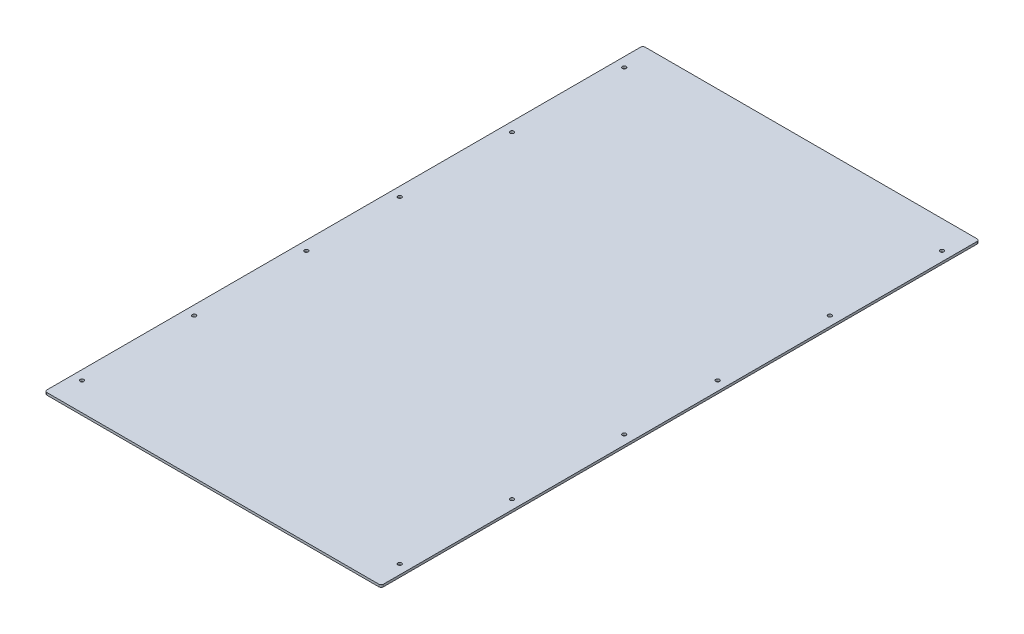
ISO-10303-21;
HEADER;
FILE_DESCRIPTION(('STEP AP214'),'2;1');
FILE_NAME('part.step','',(''),(''),'','','');
FILE_SCHEMA(('AUTOMOTIVE_DESIGN { 1 0 10303 214 1 1 1 1 }'));
ENDSEC;
DATA;
#1=APPLICATION_CONTEXT('core data for automotive mechanical design processes');
#2=APPLICATION_PROTOCOL_DEFINITION('international standard','automotive_design',2000,#1);
#3=PRODUCT_CONTEXT('',#1,'mechanical');
#4=PRODUCT('Part','Part','',(#3));
#5=PRODUCT_RELATED_PRODUCT_CATEGORY('part','',(#4));
#6=PRODUCT_DEFINITION_FORMATION('','',#4);
#7=PRODUCT_DEFINITION_CONTEXT('part definition',#1,'design');
#8=PRODUCT_DEFINITION('design','',#6,#7);
#9=PRODUCT_DEFINITION_SHAPE('','',#8);
#10=(LENGTH_UNIT() NAMED_UNIT(*) SI_UNIT(.MILLI.,.METRE.));
#11=(NAMED_UNIT(*) PLANE_ANGLE_UNIT() SI_UNIT($,.RADIAN.));
#12=(NAMED_UNIT(*) SI_UNIT($,.STERADIAN.) SOLID_ANGLE_UNIT());
#13=UNCERTAINTY_MEASURE_WITH_UNIT(LENGTH_MEASURE(1.E-05),#10,'distance_accuracy_value','');
#14=(GEOMETRIC_REPRESENTATION_CONTEXT(3) GLOBAL_UNCERTAINTY_ASSIGNED_CONTEXT((#13)) GLOBAL_UNIT_ASSIGNED_CONTEXT((#10,
#11,#12)) REPRESENTATION_CONTEXT('',''));
#15=CARTESIAN_POINT('',(0.,0.,0.));
#16=DIRECTION('',(0.,0.,1.));
#17=DIRECTION('',(1.,0.,0.));
#18=AXIS2_PLACEMENT_3D('',#15,#16,#17);
#19=CARTESIAN_POINT('',(228.6,3.175,406.4));
#20=DIRECTION('',(-1.,0.,0.));
#21=DIRECTION('',(0.,0.,1.));
#22=AXIS2_PLACEMENT_3D('',#19,#20,#21);
#23=PLANE('',#22);
#24=DIRECTION('',(0.,0.,-1.));
#25=VECTOR('',#24,1.);
#26=CARTESIAN_POINT('',(228.6,3.175,406.4));
#27=LINE('',#26,#25);
#28=CARTESIAN_POINT('',(228.6,3.175,403.225));
#29=VERTEX_POINT('',#28);
#30=CARTESIAN_POINT('',(228.6,3.175,-403.225));
#31=VERTEX_POINT('',#30);
#32=EDGE_CURVE('E129',#29,#31,#27,.T.);
#33=ORIENTED_EDGE('',*,*,#32,.F.);
#34=DIRECTION('',(0.,-1.,0.));
#35=VECTOR('',#34,1.);
#36=CARTESIAN_POINT('',(228.6,3.175,403.225));
#37=LINE('',#36,#35);
#38=CARTESIAN_POINT('',(228.6,0.,403.225));
#39=VERTEX_POINT('',#38);
#40=EDGE_CURVE('E113',#29,#39,#37,.T.);
#41=ORIENTED_EDGE('',*,*,#40,.T.);
#42=DIRECTION('',(0.,0.,-1.));
#43=VECTOR('',#42,1.);
#44=CARTESIAN_POINT('',(228.6,0.,406.4));
#45=LINE('',#44,#43);
#46=CARTESIAN_POINT('',(228.6,0.,-403.225));
#47=VERTEX_POINT('',#46);
#48=EDGE_CURVE('E126',#39,#47,#45,.T.);
#49=ORIENTED_EDGE('',*,*,#48,.T.);
#50=DIRECTION('',(0.,-1.,0.));
#51=VECTOR('',#50,1.);
#52=CARTESIAN_POINT('',(228.6,3.175,-403.225));
#53=LINE('',#52,#51);
#54=EDGE_CURVE('E132',#47,#31,#53,.F.);
#55=ORIENTED_EDGE('',*,*,#54,.T.);
#56=EDGE_LOOP('',(#33,#41,#49,#55));
#57=FACE_BOUND('',#56,.T.);
#58=ADVANCED_FACE('F41',(#57),#23,.F.);
#59=CARTESIAN_POINT('',(-228.6,3.175,-406.4));
#60=DIRECTION('',(0.,0.,1.));
#61=DIRECTION('',(1.,0.,0.));
#62=AXIS2_PLACEMENT_3D('',#59,#60,#61);
#63=PLANE('',#62);
#64=DIRECTION('',(-1.,0.,0.));
#65=VECTOR('',#64,1.);
#66=CARTESIAN_POINT('',(-228.6,3.175,-406.4));
#67=LINE('',#66,#65);
#68=CARTESIAN_POINT('',(225.425,3.175,-406.4));
#69=VERTEX_POINT('',#68);
#70=CARTESIAN_POINT('',(-225.425,3.175,-406.4));
#71=VERTEX_POINT('',#70);
#72=EDGE_CURVE('E194',#69,#71,#67,.T.);
#73=ORIENTED_EDGE('',*,*,#72,.F.);
#74=DIRECTION('',(0.,-1.,0.));
#75=VECTOR('',#74,1.);
#76=CARTESIAN_POINT('',(225.425,3.175,-406.4));
#77=LINE('',#76,#75);
#78=CARTESIAN_POINT('',(225.425,0.,-406.4));
#79=VERTEX_POINT('',#78);
#80=EDGE_CURVE('E11',#69,#79,#77,.T.);
#81=ORIENTED_EDGE('',*,*,#80,.T.);
#82=DIRECTION('',(-1.,0.,0.));
#83=VECTOR('',#82,1.);
#84=CARTESIAN_POINT('',(-228.6,0.,-406.4));
#85=LINE('',#84,#83);
#86=CARTESIAN_POINT('',(-225.425,0.,-406.4));
#87=VERTEX_POINT('',#86);
#88=EDGE_CURVE('E138',#79,#87,#85,.T.);
#89=ORIENTED_EDGE('',*,*,#88,.T.);
#90=DIRECTION('',(0.,-1.,0.));
#91=VECTOR('',#90,1.);
#92=CARTESIAN_POINT('',(-225.425,3.175,-406.4));
#93=LINE('',#92,#91);
#94=EDGE_CURVE('E50',#87,#71,#93,.F.);
#95=ORIENTED_EDGE('',*,*,#94,.T.);
#96=EDGE_LOOP('',(#73,#81,#89,#95));
#97=FACE_BOUND('',#96,.T.);
#98=ADVANCED_FACE('F193',(#97),#63,.F.);
#99=CARTESIAN_POINT('',(-228.6,3.175,406.4));
#100=DIRECTION('',(1.,0.,0.));
#101=DIRECTION('',(0.,0.,-1.));
#102=AXIS2_PLACEMENT_3D('',#99,#100,#101);
#103=PLANE('',#102);
#104=DIRECTION('',(0.,0.,1.));
#105=VECTOR('',#104,1.);
#106=CARTESIAN_POINT('',(-228.6,0.,406.4));
#107=LINE('',#106,#105);
#108=CARTESIAN_POINT('',(-228.6,0.,-403.225));
#109=VERTEX_POINT('',#108);
#110=CARTESIAN_POINT('',(-228.6,0.,403.225));
#111=VERTEX_POINT('',#110);
#112=EDGE_CURVE('E145',#109,#111,#107,.T.);
#113=ORIENTED_EDGE('',*,*,#112,.T.);
#114=DIRECTION('',(0.,-1.,0.));
#115=VECTOR('',#114,1.);
#116=CARTESIAN_POINT('',(-228.6,3.175,403.225));
#117=LINE('',#116,#115);
#118=CARTESIAN_POINT('',(-228.6,3.175,403.225));
#119=VERTEX_POINT('',#118);
#120=EDGE_CURVE('E57',#111,#119,#117,.F.);
#121=ORIENTED_EDGE('',*,*,#120,.T.);
#122=DIRECTION('',(0.,0.,1.));
#123=VECTOR('',#122,1.);
#124=CARTESIAN_POINT('',(-228.6,3.175,406.4));
#125=LINE('',#124,#123);
#126=CARTESIAN_POINT('',(-228.6,3.175,-403.225));
#127=VERTEX_POINT('',#126);
#128=EDGE_CURVE('E201',#127,#119,#125,.T.);
#129=ORIENTED_EDGE('',*,*,#128,.F.);
#130=DIRECTION('',(0.,-1.,0.));
#131=VECTOR('',#130,1.);
#132=CARTESIAN_POINT('',(-228.6,3.175,-403.225));
#133=LINE('',#132,#131);
#134=EDGE_CURVE('E183',#127,#109,#133,.T.);
#135=ORIENTED_EDGE('',*,*,#134,.T.);
#136=EDGE_LOOP('',(#113,#121,#129,#135));
#137=FACE_BOUND('',#136,.T.);
#138=ADVANCED_FACE('F205',(#137),#103,.F.);
#139=CARTESIAN_POINT('',(-228.6,3.175,406.4));
#140=DIRECTION('',(0.,0.,-1.));
#141=DIRECTION('',(-1.,0.,0.));
#142=AXIS2_PLACEMENT_3D('',#139,#140,#141);
#143=PLANE('',#142);
#144=DIRECTION('',(1.,0.,0.));
#145=VECTOR('',#144,1.);
#146=CARTESIAN_POINT('',(-228.6,0.,406.4));
#147=LINE('',#146,#145);
#148=CARTESIAN_POINT('',(-225.425,0.,406.4));
#149=VERTEX_POINT('',#148);
#150=CARTESIAN_POINT('',(225.425,0.,406.4));
#151=VERTEX_POINT('',#150);
#152=EDGE_CURVE('E156',#149,#151,#147,.T.);
#153=ORIENTED_EDGE('',*,*,#152,.T.);
#154=DIRECTION('',(0.,-1.,0.));
#155=VECTOR('',#154,1.);
#156=CARTESIAN_POINT('',(225.425,3.175,406.4));
#157=LINE('',#156,#155);
#158=CARTESIAN_POINT('',(225.425,3.175,406.4));
#159=VERTEX_POINT('',#158);
#160=EDGE_CURVE('E114',#151,#159,#157,.F.);
#161=ORIENTED_EDGE('',*,*,#160,.T.);
#162=DIRECTION('',(1.,0.,0.));
#163=VECTOR('',#162,1.);
#164=CARTESIAN_POINT('',(-228.6,3.175,406.4));
#165=LINE('',#164,#163);
#166=CARTESIAN_POINT('',(-225.425,3.175,406.4));
#167=VERTEX_POINT('',#166);
#168=EDGE_CURVE('E151',#167,#159,#165,.T.);
#169=ORIENTED_EDGE('',*,*,#168,.F.);
#170=DIRECTION('',(0.,-1.,0.));
#171=VECTOR('',#170,1.);
#172=CARTESIAN_POINT('',(-225.425,3.175,406.4));
#173=LINE('',#172,#171);
#174=EDGE_CURVE('E120',#167,#149,#173,.T.);
#175=ORIENTED_EDGE('',*,*,#174,.T.);
#176=EDGE_LOOP('',(#153,#161,#169,#175));
#177=FACE_BOUND('',#176,.T.);
#178=ADVANCED_FACE('F212',(#177),#143,.F.);
#179=CARTESIAN_POINT('',(0.,3.175,0.));
#180=DIRECTION('',(0.,-1.,0.));
#181=DIRECTION('',(0.,0.,-1.));
#182=AXIS2_PLACEMENT_3D('',#179,#180,#181);
#183=PLANE('',#182);
#184=CARTESIAN_POINT('',(-215.9,3.175,-368.3));
#185=DIRECTION('',(0.,1.,0.));
#186=DIRECTION('',(0.,0.,1.));
#187=AXIS2_PLACEMENT_3D('',#184,#185,#186);
#188=CIRCLE('',#187,2.55269999999999);
#189=CARTESIAN_POINT('',(-215.9,3.175,-365.7473));
#190=VERTEX_POINT('',#189);
#191=EDGE_CURVE('E307',#190,#190,#188,.T.);
#192=ORIENTED_EDGE('',*,*,#191,.F.);
#193=EDGE_LOOP('',(#192));
#194=FACE_BOUND('',#193,.T.);
#195=CARTESIAN_POINT('',(215.9,3.175,-368.3));
#196=DIRECTION('',(0.,1.,0.));
#197=DIRECTION('',(0.,0.,1.));
#198=AXIS2_PLACEMENT_3D('',#195,#196,#197);
#199=CIRCLE('',#198,2.55269999999999);
#200=CARTESIAN_POINT('',(215.9,3.175,-365.7473));
#201=VERTEX_POINT('',#200);
#202=EDGE_CURVE('E299',#201,#201,#199,.T.);
#203=ORIENTED_EDGE('',*,*,#202,.F.);
#204=EDGE_LOOP('',(#203));
#205=FACE_BOUND('',#204,.T.);
#206=CARTESIAN_POINT('',(215.9,3.175,-215.9));
#207=DIRECTION('',(0.,1.,0.));
#208=DIRECTION('',(0.,0.,1.));
#209=AXIS2_PLACEMENT_3D('',#206,#207,#208);
#210=CIRCLE('',#209,2.55269999999999);
#211=CARTESIAN_POINT('',(215.9,3.175,-213.3473));
#212=VERTEX_POINT('',#211);
#213=EDGE_CURVE('E291',#212,#212,#210,.T.);
#214=ORIENTED_EDGE('',*,*,#213,.F.);
#215=EDGE_LOOP('',(#214));
#216=FACE_BOUND('',#215,.T.);
#217=CARTESIAN_POINT('',(215.9,3.175,-63.5000000000002));
#218=DIRECTION('',(0.,1.,0.));
#219=DIRECTION('',(0.,0.,1.));
#220=AXIS2_PLACEMENT_3D('',#217,#218,#219);
#221=CIRCLE('',#220,2.55269999999999);
#222=CARTESIAN_POINT('',(215.9,3.175,-60.9473000000002));
#223=VERTEX_POINT('',#222);
#224=EDGE_CURVE('E283',#223,#223,#221,.T.);
#225=ORIENTED_EDGE('',*,*,#224,.F.);
#226=EDGE_LOOP('',(#225));
#227=FACE_BOUND('',#226,.T.);
#228=CARTESIAN_POINT('',(215.9,3.175,63.4999999999997));
#229=DIRECTION('',(0.,1.,0.));
#230=DIRECTION('',(0.,0.,1.));
#231=AXIS2_PLACEMENT_3D('',#228,#229,#230);
#232=CIRCLE('',#231,2.55269999999999);
#233=CARTESIAN_POINT('',(215.9,3.175,66.0526999999997));
#234=VERTEX_POINT('',#233);
#235=EDGE_CURVE('E275',#234,#234,#232,.T.);
#236=ORIENTED_EDGE('',*,*,#235,.F.);
#237=EDGE_LOOP('',(#236));
#238=FACE_BOUND('',#237,.T.);
#239=CARTESIAN_POINT('',(215.9,3.175,215.9));
#240=DIRECTION('',(0.,1.,0.));
#241=DIRECTION('',(0.,0.,1.));
#242=AXIS2_PLACEMENT_3D('',#239,#240,#241);
#243=CIRCLE('',#242,2.55269999999999);
#244=CARTESIAN_POINT('',(215.9,3.175,218.4527));
#245=VERTEX_POINT('',#244);
#246=EDGE_CURVE('E267',#245,#245,#243,.T.);
#247=ORIENTED_EDGE('',*,*,#246,.F.);
#248=EDGE_LOOP('',(#247));
#249=FACE_BOUND('',#248,.T.);
#250=CARTESIAN_POINT('',(215.9,3.175,368.299999999999));
#251=DIRECTION('',(0.,1.,0.));
#252=DIRECTION('',(0.,0.,1.));
#253=AXIS2_PLACEMENT_3D('',#250,#251,#252);
#254=CIRCLE('',#253,2.55269999999999);
#255=CARTESIAN_POINT('',(215.9,3.175,370.852699999999));
#256=VERTEX_POINT('',#255);
#257=EDGE_CURVE('E259',#256,#256,#254,.T.);
#258=ORIENTED_EDGE('',*,*,#257,.F.);
#259=EDGE_LOOP('',(#258));
#260=FACE_BOUND('',#259,.T.);
#261=CARTESIAN_POINT('',(-215.9,3.175,-215.9));
#262=DIRECTION('',(0.,1.,0.));
#263=DIRECTION('',(0.,0.,1.));
#264=AXIS2_PLACEMENT_3D('',#261,#262,#263);
#265=CIRCLE('',#264,2.55269999999999);
#266=CARTESIAN_POINT('',(-215.9,3.175,-213.3473));
#267=VERTEX_POINT('',#266);
#268=EDGE_CURVE('E251',#267,#267,#265,.T.);
#269=ORIENTED_EDGE('',*,*,#268,.F.);
#270=EDGE_LOOP('',(#269));
#271=FACE_BOUND('',#270,.T.);
#272=CARTESIAN_POINT('',(-215.9,3.175,-63.5000000000002));
#273=DIRECTION('',(0.,1.,0.));
#274=DIRECTION('',(0.,0.,1.));
#275=AXIS2_PLACEMENT_3D('',#272,#273,#274);
#276=CIRCLE('',#275,2.55269999999999);
#277=CARTESIAN_POINT('',(-215.9,3.175,-60.9473000000002));
#278=VERTEX_POINT('',#277);
#279=EDGE_CURVE('E243',#278,#278,#276,.T.);
#280=ORIENTED_EDGE('',*,*,#279,.F.);
#281=EDGE_LOOP('',(#280));
#282=FACE_BOUND('',#281,.T.);
#283=CARTESIAN_POINT('',(-215.9,3.175,63.4999999999997));
#284=DIRECTION('',(0.,1.,0.));
#285=DIRECTION('',(0.,0.,1.));
#286=AXIS2_PLACEMENT_3D('',#283,#284,#285);
#287=CIRCLE('',#286,2.55269999999999);
#288=CARTESIAN_POINT('',(-215.9,3.175,66.0526999999997));
#289=VERTEX_POINT('',#288);
#290=EDGE_CURVE('E235',#289,#289,#287,.T.);
#291=ORIENTED_EDGE('',*,*,#290,.F.);
#292=EDGE_LOOP('',(#291));
#293=FACE_BOUND('',#292,.T.);
#294=CARTESIAN_POINT('',(-215.9,3.175,215.9));
#295=DIRECTION('',(0.,1.,0.));
#296=DIRECTION('',(0.,0.,1.));
#297=AXIS2_PLACEMENT_3D('',#294,#295,#296);
#298=CIRCLE('',#297,2.55269999999999);
#299=CARTESIAN_POINT('',(-215.9,3.175,218.4527));
#300=VERTEX_POINT('',#299);
#301=EDGE_CURVE('E227',#300,#300,#298,.T.);
#302=ORIENTED_EDGE('',*,*,#301,.F.);
#303=EDGE_LOOP('',(#302));
#304=FACE_BOUND('',#303,.T.);
#305=CARTESIAN_POINT('',(-215.9,3.175,368.299999999999));
#306=DIRECTION('',(0.,1.,0.));
#307=DIRECTION('',(0.,0.,1.));
#308=AXIS2_PLACEMENT_3D('',#305,#306,#307);
#309=CIRCLE('',#308,2.55269999999999);
#310=CARTESIAN_POINT('',(-215.9,3.175,370.852699999999));
#311=VERTEX_POINT('',#310);
#312=EDGE_CURVE('E148',#311,#311,#309,.T.);
#313=ORIENTED_EDGE('',*,*,#312,.F.);
#314=EDGE_LOOP('',(#313));
#315=FACE_BOUND('',#314,.T.);
#316=ORIENTED_EDGE('',*,*,#168,.T.);
#317=CARTESIAN_POINT('',(225.425,3.175,403.225));
#318=DIRECTION('',(0.,-1.,0.));
#319=DIRECTION('',(0.,0.,-1.));
#320=AXIS2_PLACEMENT_3D('',#317,#318,#319);
#321=CIRCLE('',#320,3.175);
#322=EDGE_CURVE('E180',#159,#29,#321,.F.);
#323=ORIENTED_EDGE('',*,*,#322,.T.);
#324=ORIENTED_EDGE('',*,*,#32,.T.);
#325=CARTESIAN_POINT('',(225.425,3.175,-403.225));
#326=DIRECTION('',(0.,-1.,0.));
#327=DIRECTION('',(0.,0.,-1.));
#328=AXIS2_PLACEMENT_3D('',#325,#326,#327);
#329=CIRCLE('',#328,3.175);
#330=EDGE_CURVE('E174',#31,#69,#329,.F.);
#331=ORIENTED_EDGE('',*,*,#330,.T.);
#332=ORIENTED_EDGE('',*,*,#72,.T.);
#333=CARTESIAN_POINT('',(-225.425,3.175,-403.225));
#334=DIRECTION('',(0.,-1.,0.));
#335=DIRECTION('',(0.,0.,-1.));
#336=AXIS2_PLACEMENT_3D('',#333,#334,#335);
#337=CIRCLE('',#336,3.175);
#338=EDGE_CURVE('E64',#71,#127,#337,.F.);
#339=ORIENTED_EDGE('',*,*,#338,.T.);
#340=ORIENTED_EDGE('',*,*,#128,.T.);
#341=CARTESIAN_POINT('',(-225.425,3.175,403.225));
#342=DIRECTION('',(0.,-1.,0.));
#343=DIRECTION('',(0.,0.,-1.));
#344=AXIS2_PLACEMENT_3D('',#341,#342,#343);
#345=CIRCLE('',#344,3.175);
#346=EDGE_CURVE('E177',#119,#167,#345,.F.);
#347=ORIENTED_EDGE('',*,*,#346,.T.);
#348=EDGE_LOOP('',(#316,#323,#324,#331,#332,#339,#340,#347));
#349=FACE_BOUND('',#348,.T.);
#350=ADVANCED_FACE('F198',(#194,#205,#216,#227,#238,#249,#260,#271,#282,#293,#304,#315,#349),
#183,.F.);
#351=CARTESIAN_POINT('',(0.,0.,0.));
#352=DIRECTION('',(0.,-1.,0.));
#353=DIRECTION('',(0.,0.,-1.));
#354=AXIS2_PLACEMENT_3D('',#351,#352,#353);
#355=PLANE('',#354);
#356=CARTESIAN_POINT('',(-215.9,0.,-368.3));
#357=DIRECTION('',(0.,1.,0.));
#358=DIRECTION('',(0.,0.,1.));
#359=AXIS2_PLACEMENT_3D('',#356,#357,#358);
#360=CIRCLE('',#359,2.55269999999999);
#361=CARTESIAN_POINT('',(-215.9,0.,-365.7473));
#362=VERTEX_POINT('',#361);
#363=EDGE_CURVE('E303',#362,#362,#360,.T.);
#364=ORIENTED_EDGE('',*,*,#363,.T.);
#365=EDGE_LOOP('',(#364));
#366=FACE_BOUND('',#365,.T.);
#367=CARTESIAN_POINT('',(215.9,0.,-368.3));
#368=DIRECTION('',(0.,1.,0.));
#369=DIRECTION('',(0.,0.,1.));
#370=AXIS2_PLACEMENT_3D('',#367,#368,#369);
#371=CIRCLE('',#370,2.55269999999999);
#372=CARTESIAN_POINT('',(215.9,0.,-365.7473));
#373=VERTEX_POINT('',#372);
#374=EDGE_CURVE('E295',#373,#373,#371,.T.);
#375=ORIENTED_EDGE('',*,*,#374,.T.);
#376=EDGE_LOOP('',(#375));
#377=FACE_BOUND('',#376,.T.);
#378=CARTESIAN_POINT('',(215.9,0.,-215.9));
#379=DIRECTION('',(0.,1.,0.));
#380=DIRECTION('',(0.,0.,1.));
#381=AXIS2_PLACEMENT_3D('',#378,#379,#380);
#382=CIRCLE('',#381,2.55269999999999);
#383=CARTESIAN_POINT('',(215.9,0.,-213.3473));
#384=VERTEX_POINT('',#383);
#385=EDGE_CURVE('E287',#384,#384,#382,.T.);
#386=ORIENTED_EDGE('',*,*,#385,.T.);
#387=EDGE_LOOP('',(#386));
#388=FACE_BOUND('',#387,.T.);
#389=CARTESIAN_POINT('',(215.9,0.,-63.5000000000002));
#390=DIRECTION('',(0.,1.,0.));
#391=DIRECTION('',(0.,0.,1.));
#392=AXIS2_PLACEMENT_3D('',#389,#390,#391);
#393=CIRCLE('',#392,2.55269999999999);
#394=CARTESIAN_POINT('',(215.9,0.,-60.9473000000002));
#395=VERTEX_POINT('',#394);
#396=EDGE_CURVE('E279',#395,#395,#393,.T.);
#397=ORIENTED_EDGE('',*,*,#396,.T.);
#398=EDGE_LOOP('',(#397));
#399=FACE_BOUND('',#398,.T.);
#400=CARTESIAN_POINT('',(215.9,0.,63.4999999999997));
#401=DIRECTION('',(0.,1.,0.));
#402=DIRECTION('',(0.,0.,1.));
#403=AXIS2_PLACEMENT_3D('',#400,#401,#402);
#404=CIRCLE('',#403,2.55269999999999);
#405=CARTESIAN_POINT('',(215.9,0.,66.0526999999997));
#406=VERTEX_POINT('',#405);
#407=EDGE_CURVE('E271',#406,#406,#404,.T.);
#408=ORIENTED_EDGE('',*,*,#407,.T.);
#409=EDGE_LOOP('',(#408));
#410=FACE_BOUND('',#409,.T.);
#411=CARTESIAN_POINT('',(215.9,0.,215.9));
#412=DIRECTION('',(0.,1.,0.));
#413=DIRECTION('',(0.,0.,1.));
#414=AXIS2_PLACEMENT_3D('',#411,#412,#413);
#415=CIRCLE('',#414,2.55269999999999);
#416=CARTESIAN_POINT('',(215.9,0.,218.4527));
#417=VERTEX_POINT('',#416);
#418=EDGE_CURVE('E263',#417,#417,#415,.T.);
#419=ORIENTED_EDGE('',*,*,#418,.T.);
#420=EDGE_LOOP('',(#419));
#421=FACE_BOUND('',#420,.T.);
#422=CARTESIAN_POINT('',(215.9,0.,368.299999999999));
#423=DIRECTION('',(0.,1.,0.));
#424=DIRECTION('',(0.,0.,1.));
#425=AXIS2_PLACEMENT_3D('',#422,#423,#424);
#426=CIRCLE('',#425,2.55269999999999);
#427=CARTESIAN_POINT('',(215.9,0.,370.852699999999));
#428=VERTEX_POINT('',#427);
#429=EDGE_CURVE('E255',#428,#428,#426,.T.);
#430=ORIENTED_EDGE('',*,*,#429,.T.);
#431=EDGE_LOOP('',(#430));
#432=FACE_BOUND('',#431,.T.);
#433=CARTESIAN_POINT('',(-215.9,0.,-215.9));
#434=DIRECTION('',(0.,1.,0.));
#435=DIRECTION('',(0.,0.,1.));
#436=AXIS2_PLACEMENT_3D('',#433,#434,#435);
#437=CIRCLE('',#436,2.55269999999999);
#438=CARTESIAN_POINT('',(-215.9,0.,-213.3473));
#439=VERTEX_POINT('',#438);
#440=EDGE_CURVE('E247',#439,#439,#437,.T.);
#441=ORIENTED_EDGE('',*,*,#440,.T.);
#442=EDGE_LOOP('',(#441));
#443=FACE_BOUND('',#442,.T.);
#444=CARTESIAN_POINT('',(-215.9,0.,-63.5000000000002));
#445=DIRECTION('',(0.,1.,0.));
#446=DIRECTION('',(0.,0.,1.));
#447=AXIS2_PLACEMENT_3D('',#444,#445,#446);
#448=CIRCLE('',#447,2.55269999999999);
#449=CARTESIAN_POINT('',(-215.9,0.,-60.9473000000002));
#450=VERTEX_POINT('',#449);
#451=EDGE_CURVE('E239',#450,#450,#448,.T.);
#452=ORIENTED_EDGE('',*,*,#451,.T.);
#453=EDGE_LOOP('',(#452));
#454=FACE_BOUND('',#453,.T.);
#455=CARTESIAN_POINT('',(-215.9,0.,63.4999999999997));
#456=DIRECTION('',(0.,1.,0.));
#457=DIRECTION('',(0.,0.,1.));
#458=AXIS2_PLACEMENT_3D('',#455,#456,#457);
#459=CIRCLE('',#458,2.55269999999999);
#460=CARTESIAN_POINT('',(-215.9,0.,66.0526999999997));
#461=VERTEX_POINT('',#460);
#462=EDGE_CURVE('E231',#461,#461,#459,.T.);
#463=ORIENTED_EDGE('',*,*,#462,.T.);
#464=EDGE_LOOP('',(#463));
#465=FACE_BOUND('',#464,.T.);
#466=CARTESIAN_POINT('',(-215.9,0.,215.9));
#467=DIRECTION('',(0.,1.,0.));
#468=DIRECTION('',(0.,0.,1.));
#469=AXIS2_PLACEMENT_3D('',#466,#467,#468);
#470=CIRCLE('',#469,2.55269999999999);
#471=CARTESIAN_POINT('',(-215.9,0.,218.4527));
#472=VERTEX_POINT('',#471);
#473=EDGE_CURVE('E223',#472,#472,#470,.T.);
#474=ORIENTED_EDGE('',*,*,#473,.T.);
#475=EDGE_LOOP('',(#474));
#476=FACE_BOUND('',#475,.T.);
#477=CARTESIAN_POINT('',(-215.9,0.,368.299999999999));
#478=DIRECTION('',(0.,1.,0.));
#479=DIRECTION('',(0.,0.,1.));
#480=AXIS2_PLACEMENT_3D('',#477,#478,#479);
#481=CIRCLE('',#480,2.55269999999999);
#482=CARTESIAN_POINT('',(-215.9,0.,370.852699999999));
#483=VERTEX_POINT('',#482);
#484=EDGE_CURVE('E139',#483,#483,#481,.T.);
#485=ORIENTED_EDGE('',*,*,#484,.T.);
#486=EDGE_LOOP('',(#485));
#487=FACE_BOUND('',#486,.T.);
#488=ORIENTED_EDGE('',*,*,#48,.F.);
#489=CARTESIAN_POINT('',(225.425,0.,403.225));
#490=DIRECTION('',(0.,-1.,0.));
#491=DIRECTION('',(0.,0.,-1.));
#492=AXIS2_PLACEMENT_3D('',#489,#490,#491);
#493=CIRCLE('',#492,3.175);
#494=EDGE_CURVE('E109',#39,#151,#493,.T.);
#495=ORIENTED_EDGE('',*,*,#494,.T.);
#496=ORIENTED_EDGE('',*,*,#152,.F.);
#497=CARTESIAN_POINT('',(-225.425,0.,403.225));
#498=DIRECTION('',(0.,-1.,0.));
#499=DIRECTION('',(0.,0.,-1.));
#500=AXIS2_PLACEMENT_3D('',#497,#498,#499);
#501=CIRCLE('',#500,3.175);
#502=EDGE_CURVE('E121',#149,#111,#501,.T.);
#503=ORIENTED_EDGE('',*,*,#502,.T.);
#504=ORIENTED_EDGE('',*,*,#112,.F.);
#505=CARTESIAN_POINT('',(-225.425,0.,-403.225));
#506=DIRECTION('',(0.,-1.,0.));
#507=DIRECTION('',(0.,0.,-1.));
#508=AXIS2_PLACEMENT_3D('',#505,#506,#507);
#509=CIRCLE('',#508,3.175);
#510=EDGE_CURVE('E131',#109,#87,#509,.T.);
#511=ORIENTED_EDGE('',*,*,#510,.T.);
#512=ORIENTED_EDGE('',*,*,#88,.F.);
#513=CARTESIAN_POINT('',(225.425,0.,-403.225));
#514=DIRECTION('',(0.,-1.,0.));
#515=DIRECTION('',(0.,0.,-1.));
#516=AXIS2_PLACEMENT_3D('',#513,#514,#515);
#517=CIRCLE('',#516,3.175);
#518=EDGE_CURVE('E136',#79,#47,#517,.T.);
#519=ORIENTED_EDGE('',*,*,#518,.T.);
#520=EDGE_LOOP('',(#488,#495,#496,#503,#504,#511,#512,#519));
#521=FACE_BOUND('',#520,.T.);
#522=ADVANCED_FACE('F134',(#366,#377,#388,#399,#410,#421,#432,#443,#454,#465,#476,#487,#521),
#355,.T.);
#523=CARTESIAN_POINT('',(-215.9,3.175,368.299999999999));
#524=DIRECTION('',(0.,1.,0.));
#525=DIRECTION('',(0.,0.,1.));
#526=AXIS2_PLACEMENT_3D('',#523,#524,#525);
#527=CYLINDRICAL_SURFACE('',#526,2.55269999999999);
#528=ORIENTED_EDGE('',*,*,#484,.F.);
#529=EDGE_LOOP('',(#528));
#530=FACE_BOUND('',#529,.T.);
#531=ORIENTED_EDGE('',*,*,#312,.T.);
#532=EDGE_LOOP('',(#531));
#533=FACE_BOUND('',#532,.T.);
#534=ADVANCED_FACE('F340',(#530,#533),#527,.F.);
#535=CARTESIAN_POINT('',(-215.9,3.175,215.9));
#536=DIRECTION('',(0.,1.,0.));
#537=DIRECTION('',(0.,0.,1.));
#538=AXIS2_PLACEMENT_3D('',#535,#536,#537);
#539=CYLINDRICAL_SURFACE('',#538,2.55269999999999);
#540=ORIENTED_EDGE('',*,*,#473,.F.);
#541=EDGE_LOOP('',(#540));
#542=FACE_BOUND('',#541,.T.);
#543=ORIENTED_EDGE('',*,*,#301,.T.);
#544=EDGE_LOOP('',(#543));
#545=FACE_BOUND('',#544,.T.);
#546=ADVANCED_FACE('F342',(#542,#545),#539,.F.);
#547=CARTESIAN_POINT('',(-215.9,3.175,63.4999999999997));
#548=DIRECTION('',(0.,1.,0.));
#549=DIRECTION('',(0.,0.,1.));
#550=AXIS2_PLACEMENT_3D('',#547,#548,#549);
#551=CYLINDRICAL_SURFACE('',#550,2.55269999999999);
#552=ORIENTED_EDGE('',*,*,#462,.F.);
#553=EDGE_LOOP('',(#552));
#554=FACE_BOUND('',#553,.T.);
#555=ORIENTED_EDGE('',*,*,#290,.T.);
#556=EDGE_LOOP('',(#555));
#557=FACE_BOUND('',#556,.T.);
#558=ADVANCED_FACE('F349',(#554,#557),#551,.F.);
#559=CARTESIAN_POINT('',(-215.9,3.175,-63.5000000000002));
#560=DIRECTION('',(0.,1.,0.));
#561=DIRECTION('',(0.,0.,1.));
#562=AXIS2_PLACEMENT_3D('',#559,#560,#561);
#563=CYLINDRICAL_SURFACE('',#562,2.55269999999999);
#564=ORIENTED_EDGE('',*,*,#451,.F.);
#565=EDGE_LOOP('',(#564));
#566=FACE_BOUND('',#565,.T.);
#567=ORIENTED_EDGE('',*,*,#279,.T.);
#568=EDGE_LOOP('',(#567));
#569=FACE_BOUND('',#568,.T.);
#570=ADVANCED_FACE('F507',(#566,#569),#563,.F.);
#571=CARTESIAN_POINT('',(-215.9,3.175,-215.9));
#572=DIRECTION('',(0.,1.,0.));
#573=DIRECTION('',(0.,0.,1.));
#574=AXIS2_PLACEMENT_3D('',#571,#572,#573);
#575=CYLINDRICAL_SURFACE('',#574,2.55269999999999);
#576=ORIENTED_EDGE('',*,*,#440,.F.);
#577=EDGE_LOOP('',(#576));
#578=FACE_BOUND('',#577,.T.);
#579=ORIENTED_EDGE('',*,*,#268,.T.);
#580=EDGE_LOOP('',(#579));
#581=FACE_BOUND('',#580,.T.);
#582=ADVANCED_FACE('F497',(#578,#581),#575,.F.);
#583=CARTESIAN_POINT('',(215.9,3.175,368.299999999999));
#584=DIRECTION('',(0.,1.,0.));
#585=DIRECTION('',(0.,0.,1.));
#586=AXIS2_PLACEMENT_3D('',#583,#584,#585);
#587=CYLINDRICAL_SURFACE('',#586,2.55269999999999);
#588=ORIENTED_EDGE('',*,*,#429,.F.);
#589=EDGE_LOOP('',(#588));
#590=FACE_BOUND('',#589,.T.);
#591=ORIENTED_EDGE('',*,*,#257,.T.);
#592=EDGE_LOOP('',(#591));
#593=FACE_BOUND('',#592,.T.);
#594=ADVANCED_FACE('F487',(#590,#593),#587,.F.);
#595=CARTESIAN_POINT('',(215.9,3.175,215.9));
#596=DIRECTION('',(0.,1.,0.));
#597=DIRECTION('',(0.,0.,1.));
#598=AXIS2_PLACEMENT_3D('',#595,#596,#597);
#599=CYLINDRICAL_SURFACE('',#598,2.55269999999999);
#600=ORIENTED_EDGE('',*,*,#418,.F.);
#601=EDGE_LOOP('',(#600));
#602=FACE_BOUND('',#601,.T.);
#603=ORIENTED_EDGE('',*,*,#246,.T.);
#604=EDGE_LOOP('',(#603));
#605=FACE_BOUND('',#604,.T.);
#606=ADVANCED_FACE('F477',(#602,#605),#599,.F.);
#607=CARTESIAN_POINT('',(215.9,3.175,63.4999999999997));
#608=DIRECTION('',(0.,1.,0.));
#609=DIRECTION('',(0.,0.,1.));
#610=AXIS2_PLACEMENT_3D('',#607,#608,#609);
#611=CYLINDRICAL_SURFACE('',#610,2.55269999999999);
#612=ORIENTED_EDGE('',*,*,#407,.F.);
#613=EDGE_LOOP('',(#612));
#614=FACE_BOUND('',#613,.T.);
#615=ORIENTED_EDGE('',*,*,#235,.T.);
#616=EDGE_LOOP('',(#615));
#617=FACE_BOUND('',#616,.T.);
#618=ADVANCED_FACE('F467',(#614,#617),#611,.F.);
#619=CARTESIAN_POINT('',(215.9,3.175,-63.5000000000002));
#620=DIRECTION('',(0.,1.,0.));
#621=DIRECTION('',(0.,0.,1.));
#622=AXIS2_PLACEMENT_3D('',#619,#620,#621);
#623=CYLINDRICAL_SURFACE('',#622,2.55269999999999);
#624=ORIENTED_EDGE('',*,*,#396,.F.);
#625=EDGE_LOOP('',(#624));
#626=FACE_BOUND('',#625,.T.);
#627=ORIENTED_EDGE('',*,*,#224,.T.);
#628=EDGE_LOOP('',(#627));
#629=FACE_BOUND('',#628,.T.);
#630=ADVANCED_FACE('F457',(#626,#629),#623,.F.);
#631=CARTESIAN_POINT('',(215.9,3.175,-215.9));
#632=DIRECTION('',(0.,1.,0.));
#633=DIRECTION('',(0.,0.,1.));
#634=AXIS2_PLACEMENT_3D('',#631,#632,#633);
#635=CYLINDRICAL_SURFACE('',#634,2.55269999999999);
#636=ORIENTED_EDGE('',*,*,#385,.F.);
#637=EDGE_LOOP('',(#636));
#638=FACE_BOUND('',#637,.T.);
#639=ORIENTED_EDGE('',*,*,#213,.T.);
#640=EDGE_LOOP('',(#639));
#641=FACE_BOUND('',#640,.T.);
#642=ADVANCED_FACE('F447',(#638,#641),#635,.F.);
#643=CARTESIAN_POINT('',(215.9,3.175,-368.3));
#644=DIRECTION('',(0.,1.,0.));
#645=DIRECTION('',(0.,0.,1.));
#646=AXIS2_PLACEMENT_3D('',#643,#644,#645);
#647=CYLINDRICAL_SURFACE('',#646,2.55269999999999);
#648=ORIENTED_EDGE('',*,*,#374,.F.);
#649=EDGE_LOOP('',(#648));
#650=FACE_BOUND('',#649,.T.);
#651=ORIENTED_EDGE('',*,*,#202,.T.);
#652=EDGE_LOOP('',(#651));
#653=FACE_BOUND('',#652,.T.);
#654=ADVANCED_FACE('F437',(#650,#653),#647,.F.);
#655=CARTESIAN_POINT('',(-215.9,3.175,-368.3));
#656=DIRECTION('',(0.,1.,0.));
#657=DIRECTION('',(0.,0.,1.));
#658=AXIS2_PLACEMENT_3D('',#655,#656,#657);
#659=CYLINDRICAL_SURFACE('',#658,2.55269999999999);
#660=ORIENTED_EDGE('',*,*,#363,.F.);
#661=EDGE_LOOP('',(#660));
#662=FACE_BOUND('',#661,.T.);
#663=ORIENTED_EDGE('',*,*,#191,.T.);
#664=EDGE_LOOP('',(#663));
#665=FACE_BOUND('',#664,.T.);
#666=ADVANCED_FACE('F313',(#662,#665),#659,.F.);
#667=CARTESIAN_POINT('',(225.425,3.175,403.225));
#668=DIRECTION('',(0.,-1.,0.));
#669=DIRECTION('',(0.,0.,-1.));
#670=AXIS2_PLACEMENT_3D('',#667,#668,#669);
#671=CYLINDRICAL_SURFACE('',#670,3.175);
#672=ORIENTED_EDGE('',*,*,#322,.F.);
#673=ORIENTED_EDGE('',*,*,#160,.F.);
#674=ORIENTED_EDGE('',*,*,#494,.F.);
#675=ORIENTED_EDGE('',*,*,#40,.F.);
#676=EDGE_LOOP('',(#672,#673,#674,#675));
#677=FACE_BOUND('',#676,.T.);
#678=ADVANCED_FACE('F112',(#677),#671,.T.);
#679=CARTESIAN_POINT('',(-225.425,3.175,403.225));
#680=DIRECTION('',(0.,-1.,0.));
#681=DIRECTION('',(0.,0.,-1.));
#682=AXIS2_PLACEMENT_3D('',#679,#680,#681);
#683=CYLINDRICAL_SURFACE('',#682,3.175);
#684=ORIENTED_EDGE('',*,*,#346,.F.);
#685=ORIENTED_EDGE('',*,*,#120,.F.);
#686=ORIENTED_EDGE('',*,*,#502,.F.);
#687=ORIENTED_EDGE('',*,*,#174,.F.);
#688=EDGE_LOOP('',(#684,#685,#686,#687));
#689=FACE_BOUND('',#688,.T.);
#690=ADVANCED_FACE('F209',(#689),#683,.T.);
#691=CARTESIAN_POINT('',(225.425,3.175,-403.225));
#692=DIRECTION('',(0.,-1.,0.));
#693=DIRECTION('',(0.,0.,-1.));
#694=AXIS2_PLACEMENT_3D('',#691,#692,#693);
#695=CYLINDRICAL_SURFACE('',#694,3.175);
#696=ORIENTED_EDGE('',*,*,#330,.F.);
#697=ORIENTED_EDGE('',*,*,#54,.F.);
#698=ORIENTED_EDGE('',*,*,#518,.F.);
#699=ORIENTED_EDGE('',*,*,#80,.F.);
#700=EDGE_LOOP('',(#696,#697,#698,#699));
#701=FACE_BOUND('',#700,.T.);
#702=ADVANCED_FACE('F366',(#701),#695,.T.);
#703=CARTESIAN_POINT('',(-225.425,3.175,-403.225));
#704=DIRECTION('',(0.,-1.,0.));
#705=DIRECTION('',(0.,0.,-1.));
#706=AXIS2_PLACEMENT_3D('',#703,#704,#705);
#707=CYLINDRICAL_SURFACE('',#706,3.175);
#708=ORIENTED_EDGE('',*,*,#338,.F.);
#709=ORIENTED_EDGE('',*,*,#94,.F.);
#710=ORIENTED_EDGE('',*,*,#510,.F.);
#711=ORIENTED_EDGE('',*,*,#134,.F.);
#712=EDGE_LOOP('',(#708,#709,#710,#711));
#713=FACE_BOUND('',#712,.T.);
#714=ADVANCED_FACE('F43',(#713),#707,.T.);
#715=CLOSED_SHELL('',(#58,#98,#138,#178,#350,#522,#534,#546,#558,#570,#582,#594,#606,#618,#630,
#642,#654,#666,#678,#690,#702,#714));
#716=MANIFOLD_SOLID_BREP('B2',#715);
#717=ADVANCED_BREP_SHAPE_REPRESENTATION('',(#18,#716),#14);
#718=SHAPE_DEFINITION_REPRESENTATION(#9,#717);
ENDSEC;
END-ISO-10303-21;
